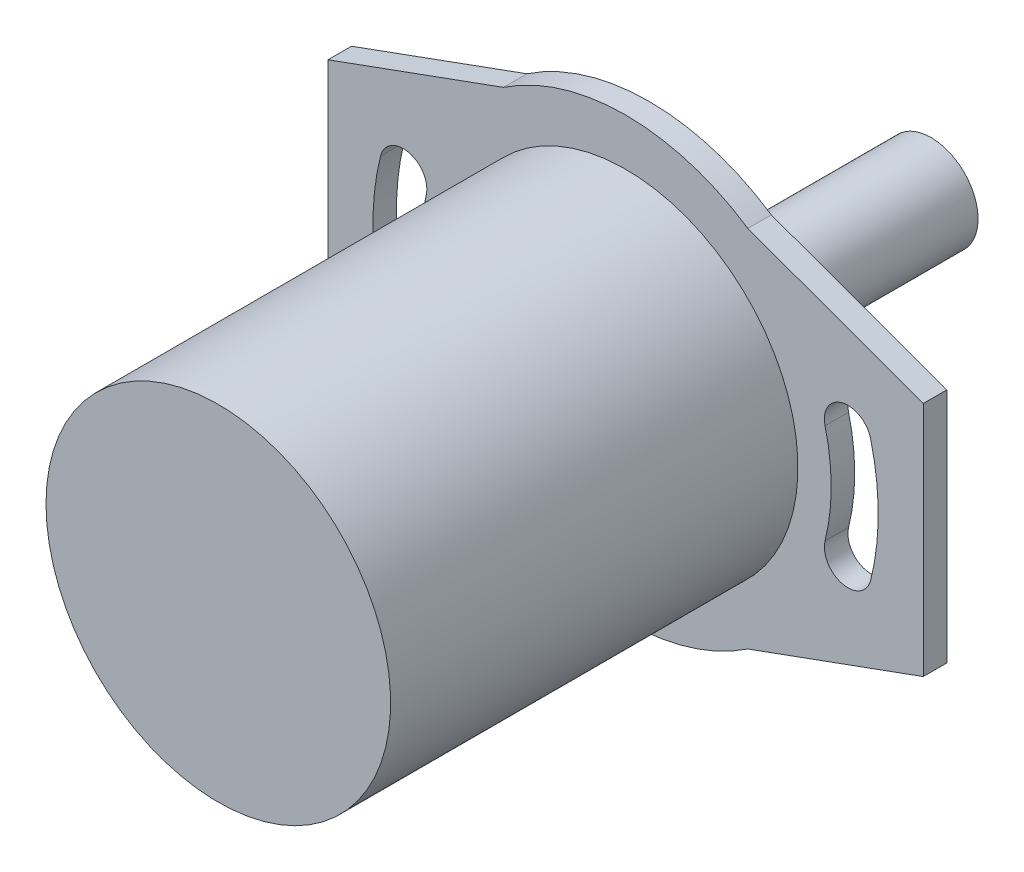
ISO-10303-21;
HEADER;
FILE_DESCRIPTION(('STEP AP214'),'2;1');
FILE_NAME('part.step','',(''),(''),'','','');
FILE_SCHEMA(('AUTOMOTIVE_DESIGN { 1 0 10303 214 1 1 1 1 }'));
ENDSEC;
DATA;
#1=APPLICATION_CONTEXT('core data for automotive mechanical design processes');
#2=APPLICATION_PROTOCOL_DEFINITION('international standard','automotive_design',2000,#1);
#3=PRODUCT_CONTEXT('',#1,'mechanical');
#4=PRODUCT('Part','Part','',(#3));
#5=PRODUCT_RELATED_PRODUCT_CATEGORY('part','',(#4));
#6=PRODUCT_DEFINITION_FORMATION('','',#4);
#7=PRODUCT_DEFINITION_CONTEXT('part definition',#1,'design');
#8=PRODUCT_DEFINITION('design','',#6,#7);
#9=PRODUCT_DEFINITION_SHAPE('','',#8);
#10=(LENGTH_UNIT() NAMED_UNIT(*) SI_UNIT(.MILLI.,.METRE.));
#11=(NAMED_UNIT(*) PLANE_ANGLE_UNIT() SI_UNIT($,.RADIAN.));
#12=(NAMED_UNIT(*) SI_UNIT($,.STERADIAN.) SOLID_ANGLE_UNIT());
#13=UNCERTAINTY_MEASURE_WITH_UNIT(LENGTH_MEASURE(1.E-05),#10,'distance_accuracy_value','');
#14=(GEOMETRIC_REPRESENTATION_CONTEXT(3) GLOBAL_UNCERTAINTY_ASSIGNED_CONTEXT((#13)) GLOBAL_UNIT_ASSIGNED_CONTEXT((#10,
#11,#12)) REPRESENTATION_CONTEXT('',''));
#15=CARTESIAN_POINT('',(0.,0.,0.));
#16=DIRECTION('',(0.,0.,1.));
#17=DIRECTION('',(1.,0.,0.));
#18=AXIS2_PLACEMENT_3D('',#15,#16,#17);
#19=CARTESIAN_POINT('',(0.,0.,0.));
#20=DIRECTION('',(0.,0.,1.));
#21=DIRECTION('',(1.,0.,0.));
#22=AXIS2_PLACEMENT_3D('',#19,#20,#21);
#23=PLANE('',#22);
#24=CARTESIAN_POINT('',(-14.1889463110085,3.54463341923386,0.));
#25=DIRECTION('',(0.,0.,-1.));
#26=DIRECTION('',(1.,0.,0.));
#27=AXIS2_PLACEMENT_3D('',#24,#25,#26);
#28=CIRCLE('',#27,1.50000000000001);
#29=CARTESIAN_POINT('',(-15.6441325613897,3.90854683847167,0.));
#30=VERTEX_POINT('',#29);
#31=CARTESIAN_POINT('',(-12.7337600606272,3.18071999999604,0.));
#32=VERTEX_POINT('',#31);
#33=EDGE_CURVE('E208',#30,#32,#28,.T.);
#34=ORIENTED_EDGE('',*,*,#33,.T.);
#35=CARTESIAN_POINT('',(-0.0149655187793923,-1.00231614613572E-13,0.));
#36=DIRECTION('',(0.,0.,1.));
#37=DIRECTION('',(1.,0.,0.));
#38=AXIS2_PLACEMENT_3D('',#35,#36,#37);
#39=CIRCLE('',#38,13.1104810863718);
#40=CARTESIAN_POINT('',(-12.7337600606272,-3.18071999999607,0.));
#41=VERTEX_POINT('',#40);
#42=EDGE_CURVE('E218',#32,#41,#39,.T.);
#43=ORIENTED_EDGE('',*,*,#42,.T.);
#44=CARTESIAN_POINT('',(-14.1889463110085,-3.54463341923386,0.));
#45=DIRECTION('',(0.,0.,-1.));
#46=DIRECTION('',(1.,0.,0.));
#47=AXIS2_PLACEMENT_3D('',#44,#45,#46);
#48=CIRCLE('',#47,1.50000000000003);
#49=CARTESIAN_POINT('',(-15.6441325613898,-3.90854683847166,0.));
#50=VERTEX_POINT('',#49);
#51=EDGE_CURVE('E62',#41,#50,#48,.T.);
#52=ORIENTED_EDGE('',*,*,#51,.T.);
#53=CARTESIAN_POINT('',(-0.0149655187793923,-1.00231614613572E-13,0.));
#54=DIRECTION('',(0.,0.,-1.));
#55=DIRECTION('',(1.,0.,0.));
#56=AXIS2_PLACEMENT_3D('',#53,#54,#55);
#57=CIRCLE('',#56,16.1104810863719);
#58=EDGE_CURVE('E196',#50,#30,#57,.T.);
#59=ORIENTED_EDGE('',*,*,#58,.T.);
#60=EDGE_LOOP('',(#34,#43,#52,#59));
#61=FACE_BOUND('',#60,.T.);
#62=DIRECTION('',(0.,1.,0.));
#63=VECTOR('',#62,1.);
#64=CARTESIAN_POINT('',(-19.,0.,0.));
#65=LINE('',#64,#63);
#66=CARTESIAN_POINT('',(-19.,-7.54936667968547,0.));
#67=VERTEX_POINT('',#66);
#68=CARTESIAN_POINT('',(-19.,7.54936667968548,0.));
#69=VERTEX_POINT('',#68);
#70=EDGE_CURVE('E270',#67,#69,#65,.T.);
#71=ORIENTED_EDGE('',*,*,#70,.F.);
#72=DIRECTION('',(0.939692620785909,-0.342020143325666,0.));
#73=VECTOR('',#72,1.);
#74=CARTESIAN_POINT('',(-19.,-7.54936667968547,0.));
#75=LINE('',#74,#73);
#76=CARTESIAN_POINT('',(-7.8,-11.6258333034669,0.));
#77=VERTEX_POINT('',#76);
#78=EDGE_CURVE('E236',#67,#77,#75,.T.);
#79=ORIENTED_EDGE('',*,*,#78,.T.);
#80=CARTESIAN_POINT('',(0.,0.,0.));
#81=DIRECTION('',(0.,0.,1.));
#82=DIRECTION('',(1.,0.,0.));
#83=AXIS2_PLACEMENT_3D('',#80,#81,#82);
#84=CIRCLE('',#83,14.);
#85=CARTESIAN_POINT('',(7.79999999999999,-11.6258333034669,0.));
#86=VERTEX_POINT('',#85);
#87=EDGE_CURVE('E189',#77,#86,#84,.T.);
#88=ORIENTED_EDGE('',*,*,#87,.T.);
#89=DIRECTION('',(0.939692620785909,0.342020143325666,0.));
#90=VECTOR('',#89,1.);
#91=CARTESIAN_POINT('',(7.79999999999999,-11.6258333034669,0.));
#92=LINE('',#91,#90);
#93=CARTESIAN_POINT('',(19.,-7.54936667968547,0.));
#94=VERTEX_POINT('',#93);
#95=EDGE_CURVE('E227',#86,#94,#92,.T.);
#96=ORIENTED_EDGE('',*,*,#95,.T.);
#97=DIRECTION('',(0.,-1.,0.));
#98=VECTOR('',#97,1.);
#99=CARTESIAN_POINT('',(19.,7.54936667968546,0.));
#100=LINE('',#99,#98);
#101=CARTESIAN_POINT('',(19.,7.54936667968546,0.));
#102=VERTEX_POINT('',#101);
#103=EDGE_CURVE('E268',#102,#94,#100,.T.);
#104=ORIENTED_EDGE('',*,*,#103,.F.);
#105=DIRECTION('',(0.939692620785909,-0.342020143325666,0.));
#106=VECTOR('',#105,1.);
#107=CARTESIAN_POINT('',(7.8,11.6258333034669,0.));
#108=LINE('',#107,#106);
#109=CARTESIAN_POINT('',(7.8,11.6258333034669,0.));
#110=VERTEX_POINT('',#109);
#111=EDGE_CURVE('E266',#110,#102,#108,.T.);
#112=ORIENTED_EDGE('',*,*,#111,.F.);
#113=CARTESIAN_POINT('',(0.,0.,0.));
#114=DIRECTION('',(0.,0.,-1.));
#115=DIRECTION('',(1.,0.,0.));
#116=AXIS2_PLACEMENT_3D('',#113,#114,#115);
#117=CIRCLE('',#116,14.);
#118=CARTESIAN_POINT('',(-7.8,11.6258333034669,0.));
#119=VERTEX_POINT('',#118);
#120=EDGE_CURVE('E250',#119,#110,#117,.T.);
#121=ORIENTED_EDGE('',*,*,#120,.F.);
#122=DIRECTION('',(0.93969262078591,0.342020143325665,0.));
#123=VECTOR('',#122,1.);
#124=CARTESIAN_POINT('',(-19.,7.54936667968548,0.));
#125=LINE('',#124,#123);
#126=EDGE_CURVE('E255',#69,#119,#125,.T.);
#127=ORIENTED_EDGE('',*,*,#126,.F.);
#128=EDGE_LOOP('',(#71,#79,#88,#96,#104,#112,#121,#127));
#129=FACE_BOUND('',#128,.T.);
#130=CARTESIAN_POINT('',(0.,0.,0.));
#131=DIRECTION('',(0.,0.,1.));
#132=DIRECTION('',(1.,0.,0.));
#133=AXIS2_PLACEMENT_3D('',#130,#131,#132);
#134=CIRCLE('',#133,11.);
#135=CARTESIAN_POINT('',(-11.,0.,0.));
#136=VERTEX_POINT('',#135);
#137=EDGE_CURVE('E41',#136,#136,#134,.T.);
#138=ORIENTED_EDGE('',*,*,#137,.F.);
#139=EDGE_LOOP('',(#138));
#140=FACE_BOUND('',#139,.T.);
#141=CARTESIAN_POINT('',(14.1889463110085,3.54463341923386,0.));
#142=DIRECTION('',(0.,0.,-1.));
#143=DIRECTION('',(-1.,0.,0.));
#144=AXIS2_PLACEMENT_3D('',#141,#142,#143);
#145=CIRCLE('',#144,1.49999999999998);
#146=CARTESIAN_POINT('',(12.7335797302425,3.18144185051399,0.));
#147=VERTEX_POINT('',#146);
#148=CARTESIAN_POINT('',(15.6443128917746,3.90782498795377,0.));
#149=VERTEX_POINT('',#148);
#150=EDGE_CURVE('E156',#147,#149,#145,.T.);
#151=ORIENTED_EDGE('',*,*,#150,.T.);
#152=CARTESIAN_POINT('',(-0.0149655187793923,-1.00231614613572E-13,0.));
#153=DIRECTION('',(0.,0.,-1.));
#154=DIRECTION('',(-1.,0.,0.));
#155=AXIS2_PLACEMENT_3D('',#152,#153,#154);
#156=CIRCLE('',#155,16.1395197101934);
#157=CARTESIAN_POINT('',(15.6443128917747,-3.90782498795375,0.));
#158=VERTEX_POINT('',#157);
#159=EDGE_CURVE('E167',#149,#158,#156,.T.);
#160=ORIENTED_EDGE('',*,*,#159,.T.);
#161=CARTESIAN_POINT('',(14.1889463110085,-3.54463341923386,0.));
#162=DIRECTION('',(0.,0.,-1.));
#163=DIRECTION('',(-1.,0.,0.));
#164=AXIS2_PLACEMENT_3D('',#161,#162,#163);
#165=CIRCLE('',#164,1.49999999999998);
#166=CARTESIAN_POINT('',(12.7335797302425,-3.18144185051399,0.));
#167=VERTEX_POINT('',#166);
#168=EDGE_CURVE('E54',#158,#167,#165,.T.);
#169=ORIENTED_EDGE('',*,*,#168,.T.);
#170=CARTESIAN_POINT('',(-0.0149655187793923,-1.00231614613572E-13,0.));
#171=DIRECTION('',(0.,0.,1.));
#172=DIRECTION('',(-1.,0.,0.));
#173=AXIS2_PLACEMENT_3D('',#170,#171,#172);
#174=CIRCLE('',#173,13.1395197101934);
#175=EDGE_CURVE('E164',#167,#147,#174,.T.);
#176=ORIENTED_EDGE('',*,*,#175,.T.);
#177=EDGE_LOOP('',(#151,#160,#169,#176));
#178=FACE_BOUND('',#177,.T.);
#179=ADVANCED_FACE('F37',(#61,#129,#140,#178),#23,.T.);
#180=CARTESIAN_POINT('',(0.,0.,-1.5));
#181=DIRECTION('',(0.,0.,1.));
#182=DIRECTION('',(1.,0.,0.));
#183=AXIS2_PLACEMENT_3D('',#180,#181,#182);
#184=PLANE('',#183);
#185=CARTESIAN_POINT('',(0.,0.,-1.5));
#186=DIRECTION('',(0.,0.,-1.));
#187=DIRECTION('',(-1.,0.,0.));
#188=AXIS2_PLACEMENT_3D('',#185,#186,#187);
#189=CIRCLE('',#188,3.);
#190=CARTESIAN_POINT('',(-3.,0.,-1.5));
#191=VERTEX_POINT('',#190);
#192=EDGE_CURVE('E11',#191,#191,#189,.T.);
#193=ORIENTED_EDGE('',*,*,#192,.F.);
#194=EDGE_LOOP('',(#193));
#195=FACE_BOUND('',#194,.T.);
#196=CARTESIAN_POINT('',(0.,0.,-1.5));
#197=DIRECTION('',(0.,0.,-1.));
#198=DIRECTION('',(1.,0.,0.));
#199=AXIS2_PLACEMENT_3D('',#196,#197,#198);
#200=CIRCLE('',#199,14.);
#201=CARTESIAN_POINT('',(-7.8,11.6258333034669,-1.5));
#202=VERTEX_POINT('',#201);
#203=CARTESIAN_POINT('',(7.8,11.6258333034669,-1.5));
#204=VERTEX_POINT('',#203);
#205=EDGE_CURVE('E251',#202,#204,#200,.T.);
#206=ORIENTED_EDGE('',*,*,#205,.T.);
#207=DIRECTION('',(0.939692620785909,-0.342020143325666,0.));
#208=VECTOR('',#207,1.);
#209=CARTESIAN_POINT('',(7.8,11.6258333034669,-1.5));
#210=LINE('',#209,#208);
#211=CARTESIAN_POINT('',(19.,7.54936667968546,-1.5));
#212=VERTEX_POINT('',#211);
#213=EDGE_CURVE('E254',#204,#212,#210,.T.);
#214=ORIENTED_EDGE('',*,*,#213,.T.);
#215=DIRECTION('',(0.,-1.,0.));
#216=VECTOR('',#215,1.);
#217=CARTESIAN_POINT('',(19.,7.54936667968546,-1.5));
#218=LINE('',#217,#216);
#219=CARTESIAN_POINT('',(19.,-7.54936667968547,-1.5));
#220=VERTEX_POINT('',#219);
#221=EDGE_CURVE('E257',#212,#220,#218,.T.);
#222=ORIENTED_EDGE('',*,*,#221,.T.);
#223=DIRECTION('',(0.939692620785909,0.342020143325666,0.));
#224=VECTOR('',#223,1.);
#225=CARTESIAN_POINT('',(7.79999999999999,-11.6258333034669,-1.5));
#226=LINE('',#225,#224);
#227=CARTESIAN_POINT('',(7.79999999999999,-11.6258333034669,-1.5));
#228=VERTEX_POINT('',#227);
#229=EDGE_CURVE('E230',#228,#220,#226,.T.);
#230=ORIENTED_EDGE('',*,*,#229,.F.);
#231=CARTESIAN_POINT('',(0.,0.,-1.5));
#232=DIRECTION('',(0.,0.,1.));
#233=DIRECTION('',(1.,0.,0.));
#234=AXIS2_PLACEMENT_3D('',#231,#232,#233);
#235=CIRCLE('',#234,14.);
#236=CARTESIAN_POINT('',(-7.8,-11.6258333034669,-1.5));
#237=VERTEX_POINT('',#236);
#238=EDGE_CURVE('E223',#237,#228,#235,.T.);
#239=ORIENTED_EDGE('',*,*,#238,.F.);
#240=DIRECTION('',(0.939692620785909,-0.342020143325666,0.));
#241=VECTOR('',#240,1.);
#242=CARTESIAN_POINT('',(-19.,-7.54936667968547,-1.5));
#243=LINE('',#242,#241);
#244=CARTESIAN_POINT('',(-19.,-7.54936667968547,-1.5));
#245=VERTEX_POINT('',#244);
#246=EDGE_CURVE('E226',#245,#237,#243,.T.);
#247=ORIENTED_EDGE('',*,*,#246,.F.);
#248=DIRECTION('',(0.,1.,0.));
#249=VECTOR('',#248,1.);
#250=CARTESIAN_POINT('',(-19.,0.,-1.5));
#251=LINE('',#250,#249);
#252=CARTESIAN_POINT('',(-19.,7.54936667968548,-1.5));
#253=VERTEX_POINT('',#252);
#254=EDGE_CURVE('E259',#245,#253,#251,.T.);
#255=ORIENTED_EDGE('',*,*,#254,.T.);
#256=DIRECTION('',(0.93969262078591,0.342020143325665,0.));
#257=VECTOR('',#256,1.);
#258=CARTESIAN_POINT('',(-19.,7.54936667968548,-1.5));
#259=LINE('',#258,#257);
#260=EDGE_CURVE('E261',#253,#202,#259,.T.);
#261=ORIENTED_EDGE('',*,*,#260,.T.);
#262=EDGE_LOOP('',(#206,#214,#222,#230,#239,#247,#255,#261));
#263=FACE_BOUND('',#262,.T.);
#264=CARTESIAN_POINT('',(-0.0149655187793923,-1.00231614613572E-13,-1.5));
#265=DIRECTION('',(0.,0.,1.));
#266=DIRECTION('',(1.,0.,0.));
#267=AXIS2_PLACEMENT_3D('',#264,#265,#266);
#268=CIRCLE('',#267,13.1104810863718);
#269=CARTESIAN_POINT('',(-12.7337600606272,3.18071999999604,-1.5));
#270=VERTEX_POINT('',#269);
#271=CARTESIAN_POINT('',(-12.7337600606272,-3.18071999999607,-1.5));
#272=VERTEX_POINT('',#271);
#273=EDGE_CURVE('E211',#270,#272,#268,.T.);
#274=ORIENTED_EDGE('',*,*,#273,.F.);
#275=CARTESIAN_POINT('',(-14.1889463110085,3.54463341923386,-1.5));
#276=DIRECTION('',(0.,0.,-1.));
#277=DIRECTION('',(1.,0.,0.));
#278=AXIS2_PLACEMENT_3D('',#275,#276,#277);
#279=CIRCLE('',#278,1.50000000000001);
#280=CARTESIAN_POINT('',(-15.6441325613897,3.90854683847167,-1.5));
#281=VERTEX_POINT('',#280);
#282=EDGE_CURVE('E183',#281,#270,#279,.T.);
#283=ORIENTED_EDGE('',*,*,#282,.F.);
#284=CARTESIAN_POINT('',(-0.0149655187793923,-1.00231614613572E-13,-1.5));
#285=DIRECTION('',(0.,0.,-1.));
#286=DIRECTION('',(1.,0.,0.));
#287=AXIS2_PLACEMENT_3D('',#284,#285,#286);
#288=CIRCLE('',#287,16.1104810863719);
#289=CARTESIAN_POINT('',(-15.6441325613898,-3.90854683847166,-1.5));
#290=VERTEX_POINT('',#289);
#291=EDGE_CURVE('E204',#290,#281,#288,.T.);
#292=ORIENTED_EDGE('',*,*,#291,.F.);
#293=CARTESIAN_POINT('',(-14.1889463110085,-3.54463341923386,-1.5));
#294=DIRECTION('',(0.,0.,-1.));
#295=DIRECTION('',(1.,0.,0.));
#296=AXIS2_PLACEMENT_3D('',#293,#294,#295);
#297=CIRCLE('',#296,1.50000000000003);
#298=EDGE_CURVE('E207',#272,#290,#297,.T.);
#299=ORIENTED_EDGE('',*,*,#298,.F.);
#300=EDGE_LOOP('',(#274,#283,#292,#299));
#301=FACE_BOUND('',#300,.T.);
#302=CARTESIAN_POINT('',(-0.0149655187793923,-1.00231614613572E-13,-1.5));
#303=DIRECTION('',(0.,0.,-1.));
#304=DIRECTION('',(-1.,0.,0.));
#305=AXIS2_PLACEMENT_3D('',#302,#303,#304);
#306=CIRCLE('',#305,16.1395197101934);
#307=CARTESIAN_POINT('',(15.6443128917746,3.90782498795377,-1.5));
#308=VERTEX_POINT('',#307);
#309=CARTESIAN_POINT('',(15.6443128917747,-3.90782498795375,-1.5));
#310=VERTEX_POINT('',#309);
#311=EDGE_CURVE('E182',#308,#310,#306,.T.);
#312=ORIENTED_EDGE('',*,*,#311,.F.);
#313=CARTESIAN_POINT('',(14.1889463110085,3.54463341923386,-1.5));
#314=DIRECTION('',(0.,0.,-1.));
#315=DIRECTION('',(-1.,0.,0.));
#316=AXIS2_PLACEMENT_3D('',#313,#314,#315);
#317=CIRCLE('',#316,1.49999999999998);
#318=CARTESIAN_POINT('',(12.7335797302425,3.18144185051399,-1.5));
#319=VERTEX_POINT('',#318);
#320=EDGE_CURVE('E159',#319,#308,#317,.T.);
#321=ORIENTED_EDGE('',*,*,#320,.F.);
#322=CARTESIAN_POINT('',(-0.0149655187793923,-1.00231614613572E-13,-1.5));
#323=DIRECTION('',(0.,0.,1.));
#324=DIRECTION('',(-1.,0.,0.));
#325=AXIS2_PLACEMENT_3D('',#322,#323,#324);
#326=CIRCLE('',#325,13.1395197101934);
#327=CARTESIAN_POINT('',(12.7335797302425,-3.18144185051399,-1.5));
#328=VERTEX_POINT('',#327);
#329=EDGE_CURVE('E172',#328,#319,#326,.T.);
#330=ORIENTED_EDGE('',*,*,#329,.F.);
#331=CARTESIAN_POINT('',(14.1889463110085,-3.54463341923386,-1.5));
#332=DIRECTION('',(0.,0.,-1.));
#333=DIRECTION('',(-1.,0.,0.));
#334=AXIS2_PLACEMENT_3D('',#331,#332,#333);
#335=CIRCLE('',#334,1.49999999999998);
#336=EDGE_CURVE('E175',#310,#328,#335,.T.);
#337=ORIENTED_EDGE('',*,*,#336,.F.);
#338=EDGE_LOOP('',(#312,#321,#330,#337));
#339=FACE_BOUND('',#338,.T.);
#340=ADVANCED_FACE('F291',(#195,#263,#301,#339),#184,.F.);
#341=CARTESIAN_POINT('',(0.,0.,26.));
#342=DIRECTION('',(0.,0.,-1.));
#343=DIRECTION('',(-1.,0.,0.));
#344=AXIS2_PLACEMENT_3D('',#341,#342,#343);
#345=CYLINDRICAL_SURFACE('',#344,11.);
#346=CARTESIAN_POINT('',(0.,0.,26.));
#347=DIRECTION('',(0.,0.,1.));
#348=DIRECTION('',(1.,0.,0.));
#349=AXIS2_PLACEMENT_3D('',#346,#347,#348);
#350=CIRCLE('',#349,11.);
#351=CARTESIAN_POINT('',(-11.,0.,26.));
#352=VERTEX_POINT('',#351);
#353=EDGE_CURVE('E46',#352,#352,#350,.T.);
#354=CARTESIAN_POINT('',(-11.,0.,26.));
#355=CARTESIAN_POINT('',(-11.,0.,25.7291666666667));
#356=CARTESIAN_POINT('',(-11.,0.,25.4583333333333));
#357=CARTESIAN_POINT('',(-11.,0.,24.9166666666667));
#358=CARTESIAN_POINT('',(-11.,0.,24.6458333333333));
#359=CARTESIAN_POINT('',(-11.,0.,24.1041666666667));
#360=CARTESIAN_POINT('',(-11.,0.,23.8333333333333));
#361=CARTESIAN_POINT('',(-11.,0.,23.2916666666667));
#362=CARTESIAN_POINT('',(-11.,0.,23.0208333333333));
#363=CARTESIAN_POINT('',(-11.,0.,22.4791666666667));
#364=CARTESIAN_POINT('',(-11.,0.,22.2083333333333));
#365=CARTESIAN_POINT('',(-11.,0.,21.6666666666667));
#366=CARTESIAN_POINT('',(-11.,0.,21.3958333333333));
#367=CARTESIAN_POINT('',(-11.,0.,20.8541666666667));
#368=CARTESIAN_POINT('',(-11.,0.,20.5833333333333));
#369=CARTESIAN_POINT('',(-11.,0.,20.0416666666667));
#370=CARTESIAN_POINT('',(-11.,0.,19.7708333333333));
#371=CARTESIAN_POINT('',(-11.,0.,19.2291666666667));
#372=CARTESIAN_POINT('',(-11.,0.,18.9583333333333));
#373=CARTESIAN_POINT('',(-11.,0.,18.4166666666667));
#374=CARTESIAN_POINT('',(-11.,0.,18.1458333333333));
#375=CARTESIAN_POINT('',(-11.,0.,17.6041666666667));
#376=CARTESIAN_POINT('',(-11.,0.,17.3333333333333));
#377=CARTESIAN_POINT('',(-11.,0.,16.7916666666667));
#378=CARTESIAN_POINT('',(-11.,0.,16.5208333333333));
#379=CARTESIAN_POINT('',(-11.,0.,15.9791666666667));
#380=CARTESIAN_POINT('',(-11.,0.,15.7083333333333));
#381=CARTESIAN_POINT('',(-11.,0.,15.1666666666667));
#382=CARTESIAN_POINT('',(-11.,0.,14.8958333333333));
#383=CARTESIAN_POINT('',(-11.,0.,14.3541666666667));
#384=CARTESIAN_POINT('',(-11.,0.,14.0833333333333));
#385=CARTESIAN_POINT('',(-11.,0.,13.5416666666667));
#386=CARTESIAN_POINT('',(-11.,0.,13.2708333333333));
#387=CARTESIAN_POINT('',(-11.,0.,12.7291666666667));
#388=CARTESIAN_POINT('',(-11.,0.,12.4583333333333));
#389=CARTESIAN_POINT('',(-11.,0.,11.9166666666667));
#390=CARTESIAN_POINT('',(-11.,0.,11.6458333333333));
#391=CARTESIAN_POINT('',(-11.,0.,11.1041666666667));
#392=CARTESIAN_POINT('',(-11.,0.,10.8333333333333));
#393=CARTESIAN_POINT('',(-11.,0.,10.2916666666667));
#394=CARTESIAN_POINT('',(-11.,0.,10.0208333333333));
#395=CARTESIAN_POINT('',(-11.,0.,9.47916666666667));
#396=CARTESIAN_POINT('',(-11.,0.,9.20833333333333));
#397=CARTESIAN_POINT('',(-11.,0.,8.66666666666667));
#398=CARTESIAN_POINT('',(-11.,0.,8.39583333333333));
#399=CARTESIAN_POINT('',(-11.,0.,7.85416666666667));
#400=CARTESIAN_POINT('',(-11.,0.,7.58333333333333));
#401=CARTESIAN_POINT('',(-11.,0.,7.04166666666667));
#402=CARTESIAN_POINT('',(-11.,0.,6.77083333333333));
#403=CARTESIAN_POINT('',(-11.,0.,6.22916666666667));
#404=CARTESIAN_POINT('',(-11.,0.,5.95833333333333));
#405=CARTESIAN_POINT('',(-11.,0.,5.41666666666667));
#406=CARTESIAN_POINT('',(-11.,0.,5.14583333333333));
#407=CARTESIAN_POINT('',(-11.,0.,4.60416666666667));
#408=CARTESIAN_POINT('',(-11.,0.,4.33333333333333));
#409=CARTESIAN_POINT('',(-11.,0.,3.79166666666667));
#410=CARTESIAN_POINT('',(-11.,0.,3.52083333333333));
#411=CARTESIAN_POINT('',(-11.,0.,2.97916666666667));
#412=CARTESIAN_POINT('',(-11.,0.,2.70833333333333));
#413=CARTESIAN_POINT('',(-11.,0.,2.16666666666667));
#414=CARTESIAN_POINT('',(-11.,0.,1.89583333333333));
#415=CARTESIAN_POINT('',(-11.,0.,1.35416666666667));
#416=CARTESIAN_POINT('',(-11.,0.,1.08333333333333));
#417=CARTESIAN_POINT('',(-11.,0.,0.541666666666667));
#418=CARTESIAN_POINT('',(-11.,0.,0.270833333333334));
#419=CARTESIAN_POINT('',(-11.,0.,0.));
#420=B_SPLINE_CURVE_WITH_KNOTS('',3,(#354,#355,#356,#357,#358,#359,#360,#361,#362,#363,#364,
#365,#366,#367,#368,#369,#370,#371,#372,#373,#374,#375,#376,#377,#378,#379,#380,#381,#382,#383,
#384,#385,#386,#387,#388,#389,#390,#391,#392,#393,#394,#395,#396,#397,#398,#399,#400,#401,#402,
#403,#404,#405,#406,#407,#408,#409,#410,#411,#412,#413,#414,#415,#416,#417,#418,#419),
.UNSPECIFIED.,.F.,.F.,(4,2,2,2,2,2,2,2,2,2,2,2,2,2,2,2,2,2,2,2,2,2,2,2,2,2,2,2,2,2,2,2,4),(0.,
0.812500000000001,1.625,2.4375,3.25,4.0625,4.875,5.6875,6.5,7.3125,8.125,8.9375,9.75,10.5625,
11.375,12.1875,13.,13.8125,14.625,15.4375,16.25,17.0625,17.875,18.6875,19.5,20.3125,21.125,
21.9375,22.75,23.5625,24.375,25.1875,26.),.UNSPECIFIED.);
#421=EDGE_CURVE('BSEAM39',#352,#136,#420,.T.);
#422=ORIENTED_EDGE('',*,*,#353,.F.);
#423=ORIENTED_EDGE('',*,*,#137,.T.);
#424=ORIENTED_EDGE('',*,*,#421,.T.);
#425=ORIENTED_EDGE('',*,*,#421,.F.);
#426=EDGE_LOOP('',(#422,#424,#423,#425));
#427=FACE_BOUND('',#426,.T.);
#428=ADVANCED_FACE('F39',(#427),#345,.T.);
#429=CARTESIAN_POINT('',(0.,0.,26.));
#430=DIRECTION('',(0.,0.,1.));
#431=DIRECTION('',(1.,0.,0.));
#432=AXIS2_PLACEMENT_3D('',#429,#430,#431);
#433=PLANE('',#432);
#434=ORIENTED_EDGE('',*,*,#353,.T.);
#435=EDGE_LOOP('',(#434));
#436=FACE_BOUND('',#435,.T.);
#437=ADVANCED_FACE('F321',(#436),#433,.T.);
#438=CARTESIAN_POINT('',(0.,0.,-1.5));
#439=DIRECTION('',(0.,0.,1.));
#440=DIRECTION('',(1.,0.,0.));
#441=AXIS2_PLACEMENT_3D('',#438,#439,#440);
#442=CYLINDRICAL_SURFACE('',#441,14.);
#443=ORIENTED_EDGE('',*,*,#120,.T.);
#444=DIRECTION('',(0.,0.,1.));
#445=VECTOR('',#444,1.);
#446=CARTESIAN_POINT('',(7.8,11.6258333034669,-1.5));
#447=LINE('',#446,#445);
#448=EDGE_CURVE('E281',#204,#110,#447,.T.);
#449=ORIENTED_EDGE('',*,*,#448,.F.);
#450=ORIENTED_EDGE('',*,*,#205,.F.);
#451=DIRECTION('',(0.,0.,1.));
#452=VECTOR('',#451,1.);
#453=CARTESIAN_POINT('',(-7.8,11.6258333034669,-1.5));
#454=LINE('',#453,#452);
#455=EDGE_CURVE('E263',#202,#119,#454,.T.);
#456=ORIENTED_EDGE('',*,*,#455,.T.);
#457=EDGE_LOOP('',(#443,#449,#450,#456));
#458=FACE_BOUND('',#457,.T.);
#459=ADVANCED_FACE('F318',(#458),#442,.T.);
#460=CARTESIAN_POINT('',(7.8,11.6258333034669,-1.5));
#461=DIRECTION('',(-0.342020143325666,-0.939692620785909,0.));
#462=DIRECTION('',(0.939692620785909,-0.342020143325666,0.));
#463=AXIS2_PLACEMENT_3D('',#460,#461,#462);
#464=PLANE('',#463);
#465=ORIENTED_EDGE('',*,*,#111,.T.);
#466=DIRECTION('',(0.,0.,1.));
#467=VECTOR('',#466,1.);
#468=CARTESIAN_POINT('',(19.,7.54936667968546,-1.5));
#469=LINE('',#468,#467);
#470=EDGE_CURVE('E278',#212,#102,#469,.T.);
#471=ORIENTED_EDGE('',*,*,#470,.F.);
#472=ORIENTED_EDGE('',*,*,#213,.F.);
#473=ORIENTED_EDGE('',*,*,#448,.T.);
#474=EDGE_LOOP('',(#465,#471,#472,#473));
#475=FACE_BOUND('',#474,.T.);
#476=ADVANCED_FACE('F314',(#475),#464,.F.);
#477=CARTESIAN_POINT('',(19.,7.54936667968546,-1.5));
#478=DIRECTION('',(-1.,0.,0.));
#479=DIRECTION('',(0.,-1.,0.));
#480=AXIS2_PLACEMENT_3D('',#477,#478,#479);
#481=PLANE('',#480);
#482=ORIENTED_EDGE('',*,*,#103,.T.);
#483=DIRECTION('',(0.,0.,1.));
#484=VECTOR('',#483,1.);
#485=CARTESIAN_POINT('',(19.,-7.54936667968547,-1.5));
#486=LINE('',#485,#484);
#487=EDGE_CURVE('E242',#220,#94,#486,.T.);
#488=ORIENTED_EDGE('',*,*,#487,.F.);
#489=ORIENTED_EDGE('',*,*,#221,.F.);
#490=ORIENTED_EDGE('',*,*,#470,.T.);
#491=EDGE_LOOP('',(#482,#488,#489,#490));
#492=FACE_BOUND('',#491,.T.);
#493=ADVANCED_FACE('F310',(#492),#481,.F.);
#494=CARTESIAN_POINT('',(-19.,0.,-1.5));
#495=DIRECTION('',(1.,0.,0.));
#496=DIRECTION('',(0.,1.,0.));
#497=AXIS2_PLACEMENT_3D('',#494,#495,#496);
#498=PLANE('',#497);
#499=ORIENTED_EDGE('',*,*,#70,.T.);
#500=DIRECTION('',(0.,0.,1.));
#501=VECTOR('',#500,1.);
#502=CARTESIAN_POINT('',(-19.,7.54936667968548,-1.5));
#503=LINE('',#502,#501);
#504=EDGE_CURVE('E275',#253,#69,#503,.T.);
#505=ORIENTED_EDGE('',*,*,#504,.F.);
#506=ORIENTED_EDGE('',*,*,#254,.F.);
#507=DIRECTION('',(0.,0.,1.));
#508=VECTOR('',#507,1.);
#509=CARTESIAN_POINT('',(-19.,-7.54936667968547,-1.5));
#510=LINE('',#509,#508);
#511=EDGE_CURVE('E245',#245,#67,#510,.T.);
#512=ORIENTED_EDGE('',*,*,#511,.T.);
#513=EDGE_LOOP('',(#499,#505,#506,#512));
#514=FACE_BOUND('',#513,.T.);
#515=ADVANCED_FACE('F306',(#514),#498,.F.);
#516=CARTESIAN_POINT('',(-19.,7.54936667968548,-1.5));
#517=DIRECTION('',(0.342020143325665,-0.93969262078591,0.));
#518=DIRECTION('',(0.93969262078591,0.342020143325665,0.));
#519=AXIS2_PLACEMENT_3D('',#516,#517,#518);
#520=PLANE('',#519);
#521=ORIENTED_EDGE('',*,*,#126,.T.);
#522=ORIENTED_EDGE('',*,*,#455,.F.);
#523=ORIENTED_EDGE('',*,*,#260,.F.);
#524=ORIENTED_EDGE('',*,*,#504,.T.);
#525=EDGE_LOOP('',(#521,#522,#523,#524));
#526=FACE_BOUND('',#525,.T.);
#527=ADVANCED_FACE('F302',(#526),#520,.F.);
#528=CARTESIAN_POINT('',(0.,0.,-1.5));
#529=DIRECTION('',(0.,0.,1.));
#530=DIRECTION('',(1.,0.,0.));
#531=AXIS2_PLACEMENT_3D('',#528,#529,#530);
#532=CYLINDRICAL_SURFACE('',#531,14.);
#533=ORIENTED_EDGE('',*,*,#87,.F.);
#534=DIRECTION('',(0.,0.,1.));
#535=VECTOR('',#534,1.);
#536=CARTESIAN_POINT('',(-7.8,-11.6258333034669,-1.5));
#537=LINE('',#536,#535);
#538=EDGE_CURVE('E248',#237,#77,#537,.T.);
#539=ORIENTED_EDGE('',*,*,#538,.F.);
#540=ORIENTED_EDGE('',*,*,#238,.T.);
#541=DIRECTION('',(0.,0.,1.));
#542=VECTOR('',#541,1.);
#543=CARTESIAN_POINT('',(7.79999999999999,-11.6258333034669,-1.5));
#544=LINE('',#543,#542);
#545=EDGE_CURVE('E233',#228,#86,#544,.T.);
#546=ORIENTED_EDGE('',*,*,#545,.T.);
#547=EDGE_LOOP('',(#533,#539,#540,#546));
#548=FACE_BOUND('',#547,.T.);
#549=ADVANCED_FACE('F305',(#548),#532,.T.);
#550=CARTESIAN_POINT('',(-19.,-7.54936667968547,-1.5));
#551=DIRECTION('',(-0.342020143325666,-0.93969262078591,0.));
#552=DIRECTION('',(0.93969262078591,-0.342020143325666,0.));
#553=AXIS2_PLACEMENT_3D('',#550,#551,#552);
#554=PLANE('',#553);
#555=ORIENTED_EDGE('',*,*,#78,.F.);
#556=ORIENTED_EDGE('',*,*,#511,.F.);
#557=ORIENTED_EDGE('',*,*,#246,.T.);
#558=ORIENTED_EDGE('',*,*,#538,.T.);
#559=EDGE_LOOP('',(#555,#556,#557,#558));
#560=FACE_BOUND('',#559,.T.);
#561=ADVANCED_FACE('F456',(#560),#554,.T.);
#562=CARTESIAN_POINT('',(7.79999999999999,-11.6258333034669,-1.5));
#563=DIRECTION('',(0.342020143325666,-0.939692620785909,0.));
#564=DIRECTION('',(0.939692620785909,0.342020143325666,0.));
#565=AXIS2_PLACEMENT_3D('',#562,#563,#564);
#566=PLANE('',#565);
#567=ORIENTED_EDGE('',*,*,#95,.F.);
#568=ORIENTED_EDGE('',*,*,#545,.F.);
#569=ORIENTED_EDGE('',*,*,#229,.T.);
#570=ORIENTED_EDGE('',*,*,#487,.T.);
#571=EDGE_LOOP('',(#567,#568,#569,#570));
#572=FACE_BOUND('',#571,.T.);
#573=ADVANCED_FACE('F437',(#572),#566,.T.);
#574=CARTESIAN_POINT('',(-14.1889463110085,3.54463341923386,0.));
#575=DIRECTION('',(0.,0.,-1.));
#576=DIRECTION('',(-1.,0.,0.));
#577=AXIS2_PLACEMENT_3D('',#574,#575,#576);
#578=CYLINDRICAL_SURFACE('',#577,1.50000000000001);
#579=ORIENTED_EDGE('',*,*,#282,.T.);
#580=DIRECTION('',(0.,0.,-1.));
#581=VECTOR('',#580,1.);
#582=CARTESIAN_POINT('',(-12.7337600606272,3.18071999999604,0.));
#583=LINE('',#582,#581);
#584=EDGE_CURVE('E193',#32,#270,#583,.T.);
#585=ORIENTED_EDGE('',*,*,#584,.F.);
#586=ORIENTED_EDGE('',*,*,#33,.F.);
#587=DIRECTION('',(0.,0.,-1.));
#588=VECTOR('',#587,1.);
#589=CARTESIAN_POINT('',(-15.6441325613897,3.90854683847167,0.));
#590=LINE('',#589,#588);
#591=EDGE_CURVE('E201',#30,#281,#590,.T.);
#592=ORIENTED_EDGE('',*,*,#591,.T.);
#593=EDGE_LOOP('',(#579,#585,#586,#592));
#594=FACE_BOUND('',#593,.T.);
#595=ADVANCED_FACE('F427',(#594),#578,.F.);
#596=CARTESIAN_POINT('',(-0.0149655187793923,-1.00231614613572E-13,0.));
#597=DIRECTION('',(0.,0.,-1.));
#598=DIRECTION('',(-1.,0.,0.));
#599=AXIS2_PLACEMENT_3D('',#596,#597,#598);
#600=CYLINDRICAL_SURFACE('',#599,16.1104810863719);
#601=ORIENTED_EDGE('',*,*,#291,.T.);
#602=ORIENTED_EDGE('',*,*,#591,.F.);
#603=ORIENTED_EDGE('',*,*,#58,.F.);
#604=DIRECTION('',(0.,0.,-1.));
#605=VECTOR('',#604,1.);
#606=CARTESIAN_POINT('',(-15.6441325613898,-3.90854683847166,0.));
#607=LINE('',#606,#605);
#608=EDGE_CURVE('E199',#50,#290,#607,.T.);
#609=ORIENTED_EDGE('',*,*,#608,.T.);
#610=EDGE_LOOP('',(#601,#602,#603,#609));
#611=FACE_BOUND('',#610,.T.);
#612=ADVANCED_FACE('F418',(#611),#600,.F.);
#613=CARTESIAN_POINT('',(-14.1889463110085,-3.54463341923386,0.));
#614=DIRECTION('',(0.,0.,-1.));
#615=DIRECTION('',(-1.,0.,0.));
#616=AXIS2_PLACEMENT_3D('',#613,#614,#615);
#617=CYLINDRICAL_SURFACE('',#616,1.50000000000003);
#618=ORIENTED_EDGE('',*,*,#298,.T.);
#619=ORIENTED_EDGE('',*,*,#608,.F.);
#620=ORIENTED_EDGE('',*,*,#51,.F.);
#621=DIRECTION('',(0.,0.,-1.));
#622=VECTOR('',#621,1.);
#623=CARTESIAN_POINT('',(-12.7337600606272,-3.18071999999607,0.));
#624=LINE('',#623,#622);
#625=EDGE_CURVE('E197',#41,#272,#624,.T.);
#626=ORIENTED_EDGE('',*,*,#625,.T.);
#627=EDGE_LOOP('',(#618,#619,#620,#626));
#628=FACE_BOUND('',#627,.T.);
#629=ADVANCED_FACE('F408',(#628),#617,.F.);
#630=CARTESIAN_POINT('',(-0.0149655187793923,-1.00231614613572E-13,0.));
#631=DIRECTION('',(0.,0.,-1.));
#632=DIRECTION('',(-1.,0.,0.));
#633=AXIS2_PLACEMENT_3D('',#630,#631,#632);
#634=CYLINDRICAL_SURFACE('',#633,13.1104810863718);
#635=ORIENTED_EDGE('',*,*,#273,.T.);
#636=ORIENTED_EDGE('',*,*,#625,.F.);
#637=ORIENTED_EDGE('',*,*,#42,.F.);
#638=ORIENTED_EDGE('',*,*,#584,.T.);
#639=EDGE_LOOP('',(#635,#636,#637,#638));
#640=FACE_BOUND('',#639,.T.);
#641=ADVANCED_FACE('F399',(#640),#634,.T.);
#642=CARTESIAN_POINT('',(14.1889463110085,3.54463341923386,0.));
#643=DIRECTION('',(0.,0.,-1.));
#644=DIRECTION('',(-1.,0.,0.));
#645=AXIS2_PLACEMENT_3D('',#642,#643,#644);
#646=CYLINDRICAL_SURFACE('',#645,1.49999999999998);
#647=ORIENTED_EDGE('',*,*,#320,.T.);
#648=DIRECTION('',(0.,0.,-1.));
#649=VECTOR('',#648,1.);
#650=CARTESIAN_POINT('',(15.6443128917746,3.90782498795377,0.));
#651=LINE('',#650,#649);
#652=EDGE_CURVE('E152',#149,#308,#651,.T.);
#653=ORIENTED_EDGE('',*,*,#652,.F.);
#654=ORIENTED_EDGE('',*,*,#150,.F.);
#655=DIRECTION('',(0.,0.,-1.));
#656=VECTOR('',#655,1.);
#657=CARTESIAN_POINT('',(12.7335797302425,3.18144185051399,0.));
#658=LINE('',#657,#656);
#659=EDGE_CURVE('E187',#147,#319,#658,.T.);
#660=ORIENTED_EDGE('',*,*,#659,.T.);
#661=EDGE_LOOP('',(#647,#653,#654,#660));
#662=FACE_BOUND('',#661,.T.);
#663=ADVANCED_FACE('F154',(#662),#646,.F.);
#664=CARTESIAN_POINT('',(-0.0149655187793923,-1.00231614613572E-13,0.));
#665=DIRECTION('',(0.,0.,-1.));
#666=DIRECTION('',(-1.,0.,0.));
#667=AXIS2_PLACEMENT_3D('',#664,#665,#666);
#668=CYLINDRICAL_SURFACE('',#667,13.1395197101934);
#669=ORIENTED_EDGE('',*,*,#329,.T.);
#670=ORIENTED_EDGE('',*,*,#659,.F.);
#671=ORIENTED_EDGE('',*,*,#175,.F.);
#672=DIRECTION('',(0.,0.,-1.));
#673=VECTOR('',#672,1.);
#674=CARTESIAN_POINT('',(12.7335797302425,-3.18144185051399,0.));
#675=LINE('',#674,#673);
#676=EDGE_CURVE('E190',#167,#328,#675,.T.);
#677=ORIENTED_EDGE('',*,*,#676,.T.);
#678=EDGE_LOOP('',(#669,#670,#671,#677));
#679=FACE_BOUND('',#678,.T.);
#680=ADVANCED_FACE('F382',(#679),#668,.T.);
#681=CARTESIAN_POINT('',(14.1889463110085,-3.54463341923386,0.));
#682=DIRECTION('',(0.,0.,-1.));
#683=DIRECTION('',(-1.,0.,0.));
#684=AXIS2_PLACEMENT_3D('',#681,#682,#683);
#685=CYLINDRICAL_SURFACE('',#684,1.49999999999998);
#686=ORIENTED_EDGE('',*,*,#336,.T.);
#687=ORIENTED_EDGE('',*,*,#676,.F.);
#688=ORIENTED_EDGE('',*,*,#168,.F.);
#689=DIRECTION('',(0.,0.,-1.));
#690=VECTOR('',#689,1.);
#691=CARTESIAN_POINT('',(15.6443128917747,-3.90782498795375,0.));
#692=LINE('',#691,#690);
#693=EDGE_CURVE('E163',#158,#310,#692,.T.);
#694=ORIENTED_EDGE('',*,*,#693,.T.);
#695=EDGE_LOOP('',(#686,#687,#688,#694));
#696=FACE_BOUND('',#695,.T.);
#697=ADVANCED_FACE('F374',(#696),#685,.F.);
#698=CARTESIAN_POINT('',(-0.0149655187793923,-1.00231614613572E-13,0.));
#699=DIRECTION('',(0.,0.,-1.));
#700=DIRECTION('',(-1.,0.,0.));
#701=AXIS2_PLACEMENT_3D('',#698,#699,#700);
#702=CYLINDRICAL_SURFACE('',#701,16.1395197101934);
#703=ORIENTED_EDGE('',*,*,#311,.T.);
#704=ORIENTED_EDGE('',*,*,#693,.F.);
#705=ORIENTED_EDGE('',*,*,#159,.F.);
#706=ORIENTED_EDGE('',*,*,#652,.T.);
#707=EDGE_LOOP('',(#703,#704,#705,#706));
#708=FACE_BOUND('',#707,.T.);
#709=ADVANCED_FACE('F168',(#708),#702,.F.);
#710=CARTESIAN_POINT('',(0.,0.,-19.5));
#711=DIRECTION('',(0.,0.,1.));
#712=DIRECTION('',(1.,0.,0.));
#713=AXIS2_PLACEMENT_3D('',#710,#711,#712);
#714=CYLINDRICAL_SURFACE('',#713,3.);
#715=CARTESIAN_POINT('',(0.,0.,-19.5));
#716=DIRECTION('',(0.,0.,-1.));
#717=DIRECTION('',(-1.,0.,0.));
#718=AXIS2_PLACEMENT_3D('',#715,#716,#717);
#719=CIRCLE('',#718,3.);
#720=CARTESIAN_POINT('',(-3.,0.,-19.5));
#721=VERTEX_POINT('',#720);
#722=EDGE_CURVE('E203',#721,#721,#719,.T.);
#723=ORIENTED_EDGE('',*,*,#722,.F.);
#724=EDGE_LOOP('',(#723));
#725=FACE_BOUND('',#724,.T.);
#726=ORIENTED_EDGE('',*,*,#192,.T.);
#727=EDGE_LOOP('',(#726));
#728=FACE_BOUND('',#727,.T.);
#729=ADVANCED_FACE('F348',(#725,#728),#714,.T.);
#730=CARTESIAN_POINT('',(0.,0.,-19.5));
#731=DIRECTION('',(0.,0.,-1.));
#732=DIRECTION('',(-1.,0.,0.));
#733=AXIS2_PLACEMENT_3D('',#730,#731,#732);
#734=PLANE('',#733);
#735=ORIENTED_EDGE('',*,*,#722,.T.);
#736=EDGE_LOOP('',(#735));
#737=FACE_BOUND('',#736,.T.);
#738=ADVANCED_FACE('F353',(#737),#734,.T.);
#739=CLOSED_SHELL('',(#179,#340,#428,#437,#459,#476,#493,#515,#527,#549,#561,#573,#595,#612,
#629,#641,#663,#680,#697,#709,#729,#738));
#740=MANIFOLD_SOLID_BREP('B2',#739);
#741=ADVANCED_BREP_SHAPE_REPRESENTATION('',(#18,#740),#14);
#742=SHAPE_DEFINITION_REPRESENTATION(#9,#741);
ENDSEC;
END-ISO-10303-21;
